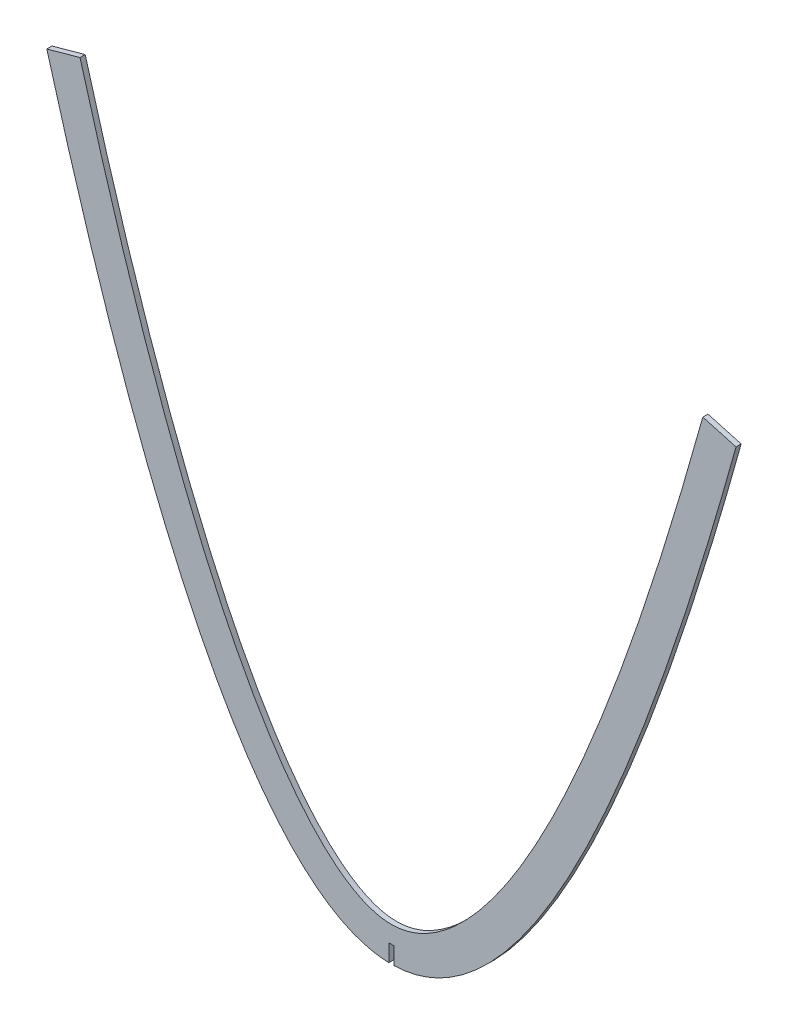
ISO-10303-21;
HEADER;
FILE_DESCRIPTION(('STEP AP214'),'2;1');
FILE_NAME('part.step','',(''),(''),'','','');
FILE_SCHEMA(('AUTOMOTIVE_DESIGN { 1 0 10303 214 1 1 1 1 }'));
ENDSEC;
DATA;
#1=APPLICATION_CONTEXT('core data for automotive mechanical design processes');
#2=APPLICATION_PROTOCOL_DEFINITION('international standard','automotive_design',2000,#1);
#3=PRODUCT_CONTEXT('',#1,'mechanical');
#4=PRODUCT('Part','Part','',(#3));
#5=PRODUCT_RELATED_PRODUCT_CATEGORY('part','',(#4));
#6=PRODUCT_DEFINITION_FORMATION('','',#4);
#7=PRODUCT_DEFINITION_CONTEXT('part definition',#1,'design');
#8=PRODUCT_DEFINITION('design','',#6,#7);
#9=PRODUCT_DEFINITION_SHAPE('','',#8);
#10=(LENGTH_UNIT() NAMED_UNIT(*) SI_UNIT(.MILLI.,.METRE.));
#11=(NAMED_UNIT(*) PLANE_ANGLE_UNIT() SI_UNIT($,.RADIAN.));
#12=(NAMED_UNIT(*) SI_UNIT($,.STERADIAN.) SOLID_ANGLE_UNIT());
#13=UNCERTAINTY_MEASURE_WITH_UNIT(LENGTH_MEASURE(1.E-05),#10,'distance_accuracy_value','');
#14=(GEOMETRIC_REPRESENTATION_CONTEXT(3) GLOBAL_UNCERTAINTY_ASSIGNED_CONTEXT((#13)) GLOBAL_UNIT_ASSIGNED_CONTEXT((#10,
#11,#12)) REPRESENTATION_CONTEXT('',''));
#15=CARTESIAN_POINT('',(0.,0.,0.));
#16=DIRECTION('',(0.,0.,1.));
#17=DIRECTION('',(1.,0.,0.));
#18=AXIS2_PLACEMENT_3D('',#15,#16,#17);
#19=CARTESIAN_POINT('',(-200.000000000246,360.000000000886,3.));
#20=CARTESIAN_POINT('',(-1.72818356847237E-10,-360.000000000264,3.));
#21=CARTESIAN_POINT('',(199.999999999901,359.999999999642,3.));
#22=B_SPLINE_CURVE_WITH_KNOTS('',2,(#19,#20,#21),.UNSPECIFIED.,.F.,.F.,(3,3),
(0.0493395108485718,0.950660489150649),.UNSPECIFIED.);
#23=DIRECTION('',(0.,0.,-1.));
#24=VECTOR('',#23,1.);
#25=SURFACE_OF_LINEAR_EXTRUSION('',#22,#24);
#26=CARTESIAN_POINT('',(-200.000000000246,360.000000000886,0.));
#27=CARTESIAN_POINT('',(-1.72818356847237E-10,-360.000000000264,0.));
#28=CARTESIAN_POINT('',(199.999999999901,359.999999999642,0.));
#29=B_SPLINE_CURVE_WITH_KNOTS('',2,(#26,#27,#28),.UNSPECIFIED.,.F.,.F.,(3,3),
(0.0493395108485718,0.950660489150649),.UNSPECIFIED.);
#30=CARTESIAN_POINT('',(-200.000000000185,360.000000000665,0.));
#31=VERTEX_POINT('',#30);
#32=CARTESIAN_POINT('',(-1.5,0.020249999999996,0.));
#33=VERTEX_POINT('',#32);
#34=EDGE_CURVE('E197',#31,#33,#29,.T.);
#35=ORIENTED_EDGE('',*,*,#34,.T.);
#36=DIRECTION('',(0.,0.,-1.));
#37=VECTOR('',#36,1.);
#38=CARTESIAN_POINT('',(-1.50000000000004,0.0202499999999997,3.));
#39=LINE('',#38,#37);
#40=CARTESIAN_POINT('',(-1.5,0.020249999999996,3.));
#41=VERTEX_POINT('',#40);
#42=EDGE_CURVE('E129',#33,#41,#39,.F.);
#43=ORIENTED_EDGE('',*,*,#42,.T.);
#44=CARTESIAN_POINT('',(-200.000000000185,360.000000000665,3.));
#45=VERTEX_POINT('',#44);
#46=EDGE_CURVE('E168',#45,#41,#22,.T.);
#47=ORIENTED_EDGE('',*,*,#46,.F.);
#48=DIRECTION('',(0.,0.,-1.));
#49=VECTOR('',#48,1.);
#50=CARTESIAN_POINT('',(-200.000000000185,360.000000000665,3.));
#51=LINE('',#50,#49);
#52=EDGE_CURVE('E199',#45,#31,#51,.T.);
#53=ORIENTED_EDGE('',*,*,#52,.T.);
#54=EDGE_LOOP('',(#35,#43,#47,#53));
#55=FACE_BOUND('',#54,.T.);
#56=ADVANCED_FACE('F39',(#55),#25,.F.);
#57=CARTESIAN_POINT('',(180.729641807327,365.352877275455,3.));
#58=CARTESIAN_POINT('',(162.101622659784,298.307766579068,3.));
#59=CARTESIAN_POINT('',(131.22454300464,208.005364048462,3.));
#60=CARTESIAN_POINT('',(106.686733526915,147.290826566175,3.));
#61=CARTESIAN_POINT('',(82.4452080538866,98.231831121364,3.));
#62=CARTESIAN_POINT('',(58.7768539695365,61.0210556928116,3.));
#63=CARTESIAN_POINT('',(39.1310592900055,39.0210944297989,3.));
#64=CARTESIAN_POINT('',(26.2090544590861,28.8854867750051,3.));
#65=CARTESIAN_POINT('',(16.683358120733,23.5588943027206,3.));
#66=CARTESIAN_POINT('',(8.0324484431941,20.6685882363666,3.));
#67=CARTESIAN_POINT('',(-8.2062376052301E-11,19.7771372545382,3.));
#68=CARTESIAN_POINT('',(-8.03244844336553,20.6685882364045,3.));
#69=CARTESIAN_POINT('',(-16.6833581209213,23.5588943028042,3.));
#70=CARTESIAN_POINT('',(-26.2090544592926,28.8854867751436,3.));
#71=CARTESIAN_POINT('',(-39.1310592902306,39.0210944300125,3.));
#72=CARTESIAN_POINT('',(-58.7768539697773,61.0210556931352,3.));
#73=CARTESIAN_POINT('',(-82.4452080541357,98.2318311218118,3.));
#74=CARTESIAN_POINT('',(-106.686733527168,147.290826566745,3.));
#75=CARTESIAN_POINT('',(-131.224543004896,208.005364049152,3.));
#76=CARTESIAN_POINT('',(-162.101622660042,298.307766579906,3.));
#77=CARTESIAN_POINT('',(-180.729641807585,365.352877276382,3.));
#78=B_SPLINE_CURVE_WITH_KNOTS('',2,(#57,#58,#59,#60,#61,#62,#63,#64,#65,#66,#67,#68,#69,#70,#71,
#72,#73,#74,#75,#76,#77),.UNSPECIFIED.,.F.,.F.,(3,1,1,1,1,1,1,1,1,1,1,1,1,1,1,1,1,1,1,3),
(0.0493395108487105,0.133838352564523,0.190170913708397,0.246503474852272,0.302836035996147,
0.359168597140021,0.401418017997927,0.429584298569865,0.457750579141802,0.485916859713739,
0.514083140285677,0.542249420857614,0.570415701429551,0.598581982001489,0.640831402859395,
0.697163964003269,0.753496525147144,0.809829086291019,0.866161647434893,0.950660489150705),.UNSPECIFIED.);
#79=DIRECTION('',(0.,0.,-1.));
#80=VECTOR('',#79,1.);
#81=SURFACE_OF_LINEAR_EXTRUSION('',#78,#80);
#82=CARTESIAN_POINT('',(180.729641807327,365.352877275455,0.));
#83=CARTESIAN_POINT('',(162.101622659784,298.307766579068,0.));
#84=CARTESIAN_POINT('',(131.22454300464,208.005364048462,0.));
#85=CARTESIAN_POINT('',(106.686733526915,147.290826566175,0.));
#86=CARTESIAN_POINT('',(82.4452080538866,98.231831121364,0.));
#87=CARTESIAN_POINT('',(58.7768539695365,61.0210556928116,0.));
#88=CARTESIAN_POINT('',(39.1310592900055,39.0210944297989,0.));
#89=CARTESIAN_POINT('',(26.2090544590861,28.8854867750051,0.));
#90=CARTESIAN_POINT('',(16.683358120733,23.5588943027206,0.));
#91=CARTESIAN_POINT('',(8.0324484431941,20.6685882363666,0.));
#92=CARTESIAN_POINT('',(-8.2062376052301E-11,19.7771372545382,0.));
#93=CARTESIAN_POINT('',(-8.03244844336553,20.6685882364045,0.));
#94=CARTESIAN_POINT('',(-16.6833581209213,23.5588943028042,0.));
#95=CARTESIAN_POINT('',(-26.2090544592926,28.8854867751436,0.));
#96=CARTESIAN_POINT('',(-39.1310592902306,39.0210944300125,0.));
#97=CARTESIAN_POINT('',(-58.7768539697773,61.0210556931352,0.));
#98=CARTESIAN_POINT('',(-82.4452080541357,98.2318311218118,0.));
#99=CARTESIAN_POINT('',(-106.686733527168,147.290826566745,0.));
#100=CARTESIAN_POINT('',(-131.224543004896,208.005364049152,0.));
#101=CARTESIAN_POINT('',(-162.101622660042,298.307766579906,0.));
#102=CARTESIAN_POINT('',(-180.729641807585,365.352877276382,0.));
#103=B_SPLINE_CURVE_WITH_KNOTS('',2,(#82,#83,#84,#85,#86,#87,#88,#89,#90,#91,#92,#93,#94,#95,
#96,#97,#98,#99,#100,#101,#102),.UNSPECIFIED.,.F.,.F.,(3,1,1,1,1,1,1,1,1,1,1,1,1,1,1,1,1,1,1,3),
(0.0493395108487105,0.133838352564523,0.190170913708397,0.246503474852272,0.302836035996147,
0.359168597140021,0.401418017997927,0.429584298569865,0.457750579141802,0.485916859713739,
0.514083140285677,0.542249420857614,0.570415701429551,0.598581982001489,0.640831402859395,
0.697163964003269,0.753496525147144,0.809829086291019,0.866161647434893,0.950660489150705),.UNSPECIFIED.);
#104=CARTESIAN_POINT('',(180.729641807327,365.352877275455,0.));
#105=VERTEX_POINT('',#104);
#106=CARTESIAN_POINT('',(-180.729641807585,365.352877276382,0.));
#107=VERTEX_POINT('',#106);
#108=EDGE_CURVE('E155',#105,#107,#103,.T.);
#109=ORIENTED_EDGE('',*,*,#108,.T.);
#110=DIRECTION('',(0.,0.,-1.));
#111=VECTOR('',#110,1.);
#112=CARTESIAN_POINT('',(-180.729641807585,365.352877276382,3.));
#113=LINE('',#112,#111);
#114=CARTESIAN_POINT('',(-180.729641807585,365.352877276382,3.));
#115=VERTEX_POINT('',#114);
#116=EDGE_CURVE('E49',#115,#107,#113,.T.);
#117=ORIENTED_EDGE('',*,*,#116,.F.);
#118=CARTESIAN_POINT('',(180.729641807327,365.352877275455,3.));
#119=VERTEX_POINT('',#118);
#120=EDGE_CURVE('E156',#119,#115,#78,.T.);
#121=ORIENTED_EDGE('',*,*,#120,.F.);
#122=DIRECTION('',(0.,0.,-1.));
#123=VECTOR('',#122,1.);
#124=CARTESIAN_POINT('',(180.729641807327,365.352877275455,3.));
#125=LINE('',#124,#123);
#126=EDGE_CURVE('E214',#119,#105,#125,.T.);
#127=ORIENTED_EDGE('',*,*,#126,.T.);
#128=EDGE_LOOP('',(#109,#117,#121,#127));
#129=FACE_BOUND('',#128,.T.);
#130=ADVANCED_FACE('F41',(#129),#81,.F.);
#131=CARTESIAN_POINT('',(-200.000000000185,360.000000000665,3.));
#132=DIRECTION('',(0.267643863785866,-0.963517909630004,0.));
#133=DIRECTION('',(0.963517909630004,0.267643863785866,0.));
#134=AXIS2_PLACEMENT_3D('',#131,#132,#133);
#135=PLANE('',#134);
#136=DIRECTION('',(-0.963517909630004,-0.267643863785866,0.));
#137=VECTOR('',#136,1.);
#138=CARTESIAN_POINT('',(-200.000000000185,360.000000000665,0.));
#139=LINE('',#138,#137);
#140=EDGE_CURVE('E206',#107,#31,#139,.T.);
#141=ORIENTED_EDGE('',*,*,#140,.T.);
#142=ORIENTED_EDGE('',*,*,#52,.F.);
#143=DIRECTION('',(-0.963517909630004,-0.267643863785866,0.));
#144=VECTOR('',#143,1.);
#145=CARTESIAN_POINT('',(-200.000000000185,360.000000000665,3.));
#146=LINE('',#145,#144);
#147=EDGE_CURVE('E94',#115,#45,#146,.T.);
#148=ORIENTED_EDGE('',*,*,#147,.F.);
#149=ORIENTED_EDGE('',*,*,#116,.T.);
#150=EDGE_LOOP('',(#141,#142,#148,#149));
#151=FACE_BOUND('',#150,.T.);
#152=ADVANCED_FACE('F184',(#151),#135,.F.);
#153=CARTESIAN_POINT('',(1.5,0.0202500000000029,3.));
#154=VERTEX_POINT('',#153);
#155=CARTESIAN_POINT('',(199.999999999901,359.999999999642,3.));
#156=VERTEX_POINT('',#155);
#157=EDGE_CURVE('E167',#154,#156,#22,.T.);
#158=ORIENTED_EDGE('',*,*,#157,.F.);
#159=DIRECTION('',(0.,0.,-1.));
#160=VECTOR('',#159,1.);
#161=CARTESIAN_POINT('',(1.50000000000002,0.0202500000000018,3.));
#162=LINE('',#161,#160);
#163=CARTESIAN_POINT('',(1.5,0.0202500000000029,0.));
#164=VERTEX_POINT('',#163);
#165=EDGE_CURVE('E122',#154,#164,#162,.T.);
#166=ORIENTED_EDGE('',*,*,#165,.T.);
#167=CARTESIAN_POINT('',(199.999999999901,359.999999999642,0.));
#168=VERTEX_POINT('',#167);
#169=EDGE_CURVE('E201',#164,#168,#29,.T.);
#170=ORIENTED_EDGE('',*,*,#169,.T.);
#171=DIRECTION('',(0.,0.,-1.));
#172=VECTOR('',#171,1.);
#173=CARTESIAN_POINT('',(199.999999999901,359.999999999642,3.));
#174=LINE('',#173,#172);
#175=EDGE_CURVE('E217',#156,#168,#174,.T.);
#176=ORIENTED_EDGE('',*,*,#175,.F.);
#177=EDGE_LOOP('',(#158,#166,#170,#176));
#178=FACE_BOUND('',#177,.T.);
#179=ADVANCED_FACE('F180',(#178),#25,.F.);
#180=CARTESIAN_POINT('',(199.999999999925,359.999999999732,3.));
#181=DIRECTION('',(-0.267643863786188,-0.963517909629915,0.));
#182=DIRECTION('',(0.963517909629915,-0.267643863786188,0.));
#183=AXIS2_PLACEMENT_3D('',#180,#181,#182);
#184=PLANE('',#183);
#185=DIRECTION('',(-0.963517909629915,0.267643863786188,0.));
#186=VECTOR('',#185,1.);
#187=CARTESIAN_POINT('',(199.999999999925,359.999999999732,0.));
#188=LINE('',#187,#186);
#189=EDGE_CURVE('E86',#168,#105,#188,.T.);
#190=ORIENTED_EDGE('',*,*,#189,.T.);
#191=ORIENTED_EDGE('',*,*,#126,.F.);
#192=DIRECTION('',(-0.963517909629915,0.267643863786188,0.));
#193=VECTOR('',#192,1.);
#194=CARTESIAN_POINT('',(199.999999999925,359.999999999732,3.));
#195=LINE('',#194,#193);
#196=EDGE_CURVE('E65',#156,#119,#195,.T.);
#197=ORIENTED_EDGE('',*,*,#196,.F.);
#198=ORIENTED_EDGE('',*,*,#175,.T.);
#199=EDGE_LOOP('',(#190,#191,#197,#198));
#200=FACE_BOUND('',#199,.T.);
#201=ADVANCED_FACE('F183',(#200),#184,.F.);
#202=CARTESIAN_POINT('',(-8.29594639512043E-11,20.,3.));
#203=DIRECTION('',(0.,0.,-1.));
#204=DIRECTION('',(-1.,0.,0.));
#205=AXIS2_PLACEMENT_3D('',#202,#203,#204);
#206=PLANE('',#205);
#207=ORIENTED_EDGE('',*,*,#46,.T.);
#208=DIRECTION('',(0.,-1.,0.));
#209=VECTOR('',#208,1.);
#210=CARTESIAN_POINT('',(-1.5,0.,3.));
#211=LINE('',#210,#209);
#212=CARTESIAN_POINT('',(-1.5,10.,3.));
#213=VERTEX_POINT('',#212);
#214=EDGE_CURVE('E139',#213,#41,#211,.T.);
#215=ORIENTED_EDGE('',*,*,#214,.F.);
#216=DIRECTION('',(-1.,0.,0.));
#217=VECTOR('',#216,1.);
#218=CARTESIAN_POINT('',(-1.5,10.,3.));
#219=LINE('',#218,#217);
#220=CARTESIAN_POINT('',(1.5,10.,3.));
#221=VERTEX_POINT('',#220);
#222=EDGE_CURVE('E118',#221,#213,#219,.T.);
#223=ORIENTED_EDGE('',*,*,#222,.F.);
#224=DIRECTION('',(0.,1.,0.));
#225=VECTOR('',#224,1.);
#226=CARTESIAN_POINT('',(1.5,10.,3.));
#227=LINE('',#226,#225);
#228=EDGE_CURVE('E144',#154,#221,#227,.T.);
#229=ORIENTED_EDGE('',*,*,#228,.F.);
#230=ORIENTED_EDGE('',*,*,#157,.T.);
#231=ORIENTED_EDGE('',*,*,#196,.T.);
#232=ORIENTED_EDGE('',*,*,#120,.T.);
#233=ORIENTED_EDGE('',*,*,#147,.T.);
#234=EDGE_LOOP('',(#207,#215,#223,#229,#230,#231,#232,#233));
#235=FACE_BOUND('',#234,.T.);
#236=ADVANCED_FACE('F238',(#235),#206,.F.);
#237=CARTESIAN_POINT('',(-8.29594639512043E-11,20.,0.));
#238=DIRECTION('',(0.,0.,-1.));
#239=DIRECTION('',(-1.,0.,0.));
#240=AXIS2_PLACEMENT_3D('',#237,#238,#239);
#241=PLANE('',#240);
#242=DIRECTION('',(0.,-1.,0.));
#243=VECTOR('',#242,1.);
#244=CARTESIAN_POINT('',(-1.5,0.,0.));
#245=LINE('',#244,#243);
#246=CARTESIAN_POINT('',(-1.5,10.,0.));
#247=VERTEX_POINT('',#246);
#248=EDGE_CURVE('E126',#247,#33,#245,.T.);
#249=ORIENTED_EDGE('',*,*,#248,.T.);
#250=ORIENTED_EDGE('',*,*,#34,.F.);
#251=ORIENTED_EDGE('',*,*,#140,.F.);
#252=ORIENTED_EDGE('',*,*,#108,.F.);
#253=ORIENTED_EDGE('',*,*,#189,.F.);
#254=ORIENTED_EDGE('',*,*,#169,.F.);
#255=DIRECTION('',(0.,-1.,0.));
#256=VECTOR('',#255,1.);
#257=CARTESIAN_POINT('',(1.5,20.,0.));
#258=LINE('',#257,#256);
#259=CARTESIAN_POINT('',(1.5,10.,0.));
#260=VERTEX_POINT('',#259);
#261=EDGE_CURVE('E11',#260,#164,#258,.T.);
#262=ORIENTED_EDGE('',*,*,#261,.F.);
#263=DIRECTION('',(-1.,0.,0.));
#264=VECTOR('',#263,1.);
#265=CARTESIAN_POINT('',(-1.5,10.,0.));
#266=LINE('',#265,#264);
#267=EDGE_CURVE('E56',#260,#247,#266,.T.);
#268=ORIENTED_EDGE('',*,*,#267,.T.);
#269=EDGE_LOOP('',(#249,#250,#251,#252,#253,#254,#262,#268));
#270=FACE_BOUND('',#269,.T.);
#271=ADVANCED_FACE('F136',(#270),#241,.T.);
#272=CARTESIAN_POINT('',(-1.5,0.,0.));
#273=DIRECTION('',(-1.,0.,0.));
#274=DIRECTION('',(0.,0.,1.));
#275=AXIS2_PLACEMENT_3D('',#272,#273,#274);
#276=PLANE('',#275);
#277=ORIENTED_EDGE('',*,*,#248,.F.);
#278=DIRECTION('',(0.,0.,1.));
#279=VECTOR('',#278,1.);
#280=CARTESIAN_POINT('',(-1.5,10.,0.));
#281=LINE('',#280,#279);
#282=EDGE_CURVE('E114',#247,#213,#281,.T.);
#283=ORIENTED_EDGE('',*,*,#282,.T.);
#284=ORIENTED_EDGE('',*,*,#214,.T.);
#285=ORIENTED_EDGE('',*,*,#42,.F.);
#286=EDGE_LOOP('',(#277,#283,#284,#285));
#287=FACE_BOUND('',#286,.T.);
#288=ADVANCED_FACE('F127',(#287),#276,.F.);
#289=CARTESIAN_POINT('',(1.5,10.,0.));
#290=DIRECTION('',(1.,0.,0.));
#291=DIRECTION('',(0.,1.,0.));
#292=AXIS2_PLACEMENT_3D('',#289,#290,#291);
#293=PLANE('',#292);
#294=ORIENTED_EDGE('',*,*,#228,.T.);
#295=DIRECTION('',(0.,0.,1.));
#296=VECTOR('',#295,1.);
#297=CARTESIAN_POINT('',(1.5,10.,0.));
#298=LINE('',#297,#296);
#299=EDGE_CURVE('E123',#260,#221,#298,.T.);
#300=ORIENTED_EDGE('',*,*,#299,.F.);
#301=ORIENTED_EDGE('',*,*,#261,.T.);
#302=ORIENTED_EDGE('',*,*,#165,.F.);
#303=EDGE_LOOP('',(#294,#300,#301,#302));
#304=FACE_BOUND('',#303,.T.);
#305=ADVANCED_FACE('F240',(#304),#293,.F.);
#306=CARTESIAN_POINT('',(-1.5,10.,0.));
#307=DIRECTION('',(0.,1.,0.));
#308=DIRECTION('',(0.,0.,1.));
#309=AXIS2_PLACEMENT_3D('',#306,#307,#308);
#310=PLANE('',#309);
#311=ORIENTED_EDGE('',*,*,#222,.T.);
#312=ORIENTED_EDGE('',*,*,#282,.F.);
#313=ORIENTED_EDGE('',*,*,#267,.F.);
#314=ORIENTED_EDGE('',*,*,#299,.T.);
#315=EDGE_LOOP('',(#311,#312,#313,#314));
#316=FACE_BOUND('',#315,.T.);
#317=ADVANCED_FACE('F116',(#316),#310,.F.);
#318=CLOSED_SHELL('',(#56,#130,#152,#179,#201,#236,#271,#288,#305,#317));
#319=MANIFOLD_SOLID_BREP('B2',#318);
#320=ADVANCED_BREP_SHAPE_REPRESENTATION('',(#18,#319),#14);
#321=SHAPE_DEFINITION_REPRESENTATION(#9,#320);
ENDSEC;
END-ISO-10303-21;
